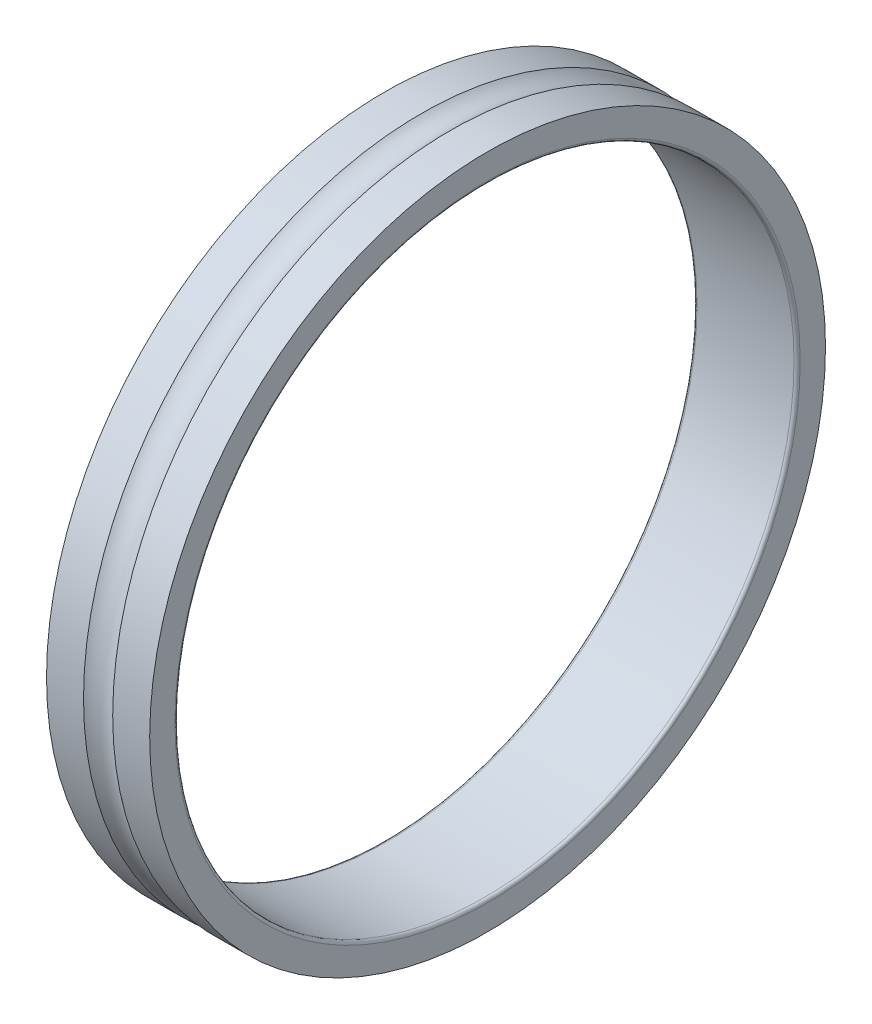
ISO-10303-21;
HEADER;
FILE_DESCRIPTION(('STEP AP214'),'2;1');
FILE_NAME('part.step','',(''),(''),'','','');
FILE_SCHEMA(('AUTOMOTIVE_DESIGN { 1 0 10303 214 1 1 1 1 }'));
ENDSEC;
DATA;
#1=APPLICATION_CONTEXT('core data for automotive mechanical design processes');
#2=APPLICATION_PROTOCOL_DEFINITION('international standard','automotive_design',2000,#1);
#3=PRODUCT_CONTEXT('',#1,'mechanical');
#4=PRODUCT('Part','Part','',(#3));
#5=PRODUCT_RELATED_PRODUCT_CATEGORY('part','',(#4));
#6=PRODUCT_DEFINITION_FORMATION('','',#4);
#7=PRODUCT_DEFINITION_CONTEXT('part definition',#1,'design');
#8=PRODUCT_DEFINITION('design','',#6,#7);
#9=PRODUCT_DEFINITION_SHAPE('','',#8);
#10=(LENGTH_UNIT() NAMED_UNIT(*) SI_UNIT(.MILLI.,.METRE.));
#11=(NAMED_UNIT(*) PLANE_ANGLE_UNIT() SI_UNIT($,.RADIAN.));
#12=(NAMED_UNIT(*) SI_UNIT($,.STERADIAN.) SOLID_ANGLE_UNIT());
#13=UNCERTAINTY_MEASURE_WITH_UNIT(LENGTH_MEASURE(1.E-05),#10,'distance_accuracy_value','');
#14=(GEOMETRIC_REPRESENTATION_CONTEXT(3) GLOBAL_UNCERTAINTY_ASSIGNED_CONTEXT((#13)) GLOBAL_UNIT_ASSIGNED_CONTEXT((#10,
#11,#12)) REPRESENTATION_CONTEXT('',''));
#15=CARTESIAN_POINT('',(0.,0.,0.));
#16=DIRECTION('',(0.,0.,1.));
#17=DIRECTION('',(1.,0.,0.));
#18=AXIS2_PLACEMENT_3D('',#15,#16,#17);
#19=CARTESIAN_POINT('',(0.,32.75,0.));
#20=DIRECTION('',(-1.,0.,0.));
#21=DIRECTION('',(0.,0.,1.));
#22=AXIS2_PLACEMENT_3D('',#19,#20,#21);
#23=PLANE('',#22);
#24=CARTESIAN_POINT('',(0.,0.,0.));
#25=DIRECTION('',(1.,0.,0.));
#26=DIRECTION('',(0.,0.,-1.));
#27=AXIS2_PLACEMENT_3D('',#24,#25,#26);
#28=CIRCLE('',#27,30.3);
#29=CARTESIAN_POINT('',(0.,0.,-30.3));
#30=VERTEX_POINT('',#29);
#31=EDGE_CURVE('E42',#30,#30,#28,.T.);
#32=ORIENTED_EDGE('',*,*,#31,.T.);
#33=EDGE_LOOP('',(#32));
#34=FACE_BOUND('',#33,.T.);
#35=CARTESIAN_POINT('',(0.,0.,0.));
#36=DIRECTION('',(1.,0.,0.));
#37=DIRECTION('',(0.,0.,-1.));
#38=AXIS2_PLACEMENT_3D('',#35,#36,#37);
#39=CIRCLE('',#38,32.75);
#40=CARTESIAN_POINT('',(0.,0.,-32.75));
#41=VERTEX_POINT('',#40);
#42=EDGE_CURVE('E41',#41,#41,#39,.T.);
#43=ORIENTED_EDGE('',*,*,#42,.F.);
#44=EDGE_LOOP('',(#43));
#45=FACE_BOUND('',#44,.T.);
#46=ADVANCED_FACE('F15',(#34,#45),#23,.T.);
#47=CARTESIAN_POINT('',(0.299999999999948,0.,0.));
#48=DIRECTION('',(1.,0.,0.));
#49=DIRECTION('',(0.,0.,-1.));
#50=AXIS2_PLACEMENT_3D('',#47,#48,#49);
#51=TOROIDAL_SURFACE('',#50,30.3,0.299999999999948);
#52=CARTESIAN_POINT('',(0.3,0.,0.));
#53=DIRECTION('',(1.,0.,0.));
#54=DIRECTION('',(0.,0.,-1.));
#55=AXIS2_PLACEMENT_3D('',#52,#53,#54);
#56=CIRCLE('',#55,30.);
#57=CARTESIAN_POINT('',(0.3,0.,-30.));
#58=VERTEX_POINT('',#57);
#59=EDGE_CURVE('E36',#58,#58,#56,.T.);
#60=ORIENTED_EDGE('',*,*,#59,.T.);
#61=EDGE_LOOP('',(#60));
#62=FACE_BOUND('',#61,.T.);
#63=ORIENTED_EDGE('',*,*,#31,.F.);
#64=EDGE_LOOP('',(#63));
#65=FACE_BOUND('',#64,.T.);
#66=ADVANCED_FACE('F49',(#62,#65),#51,.T.);
#67=CARTESIAN_POINT('',(10.,0.,0.));
#68=DIRECTION('',(1.,0.,0.));
#69=DIRECTION('',(0.,0.,-1.));
#70=AXIS2_PLACEMENT_3D('',#67,#68,#69);
#71=CYLINDRICAL_SURFACE('',#70,30.);
#72=CARTESIAN_POINT('',(9.7,0.,0.));
#73=DIRECTION('',(1.,0.,0.));
#74=DIRECTION('',(0.,0.,-1.));
#75=AXIS2_PLACEMENT_3D('',#72,#73,#74);
#76=CIRCLE('',#75,30.);
#77=CARTESIAN_POINT('',(9.7,0.,-30.));
#78=VERTEX_POINT('',#77);
#79=EDGE_CURVE('E34',#78,#78,#76,.T.);
#80=ORIENTED_EDGE('',*,*,#79,.T.);
#81=EDGE_LOOP('',(#80));
#82=FACE_BOUND('',#81,.T.);
#83=ORIENTED_EDGE('',*,*,#59,.F.);
#84=EDGE_LOOP('',(#83));
#85=FACE_BOUND('',#84,.T.);
#86=ADVANCED_FACE('F55',(#82,#85),#71,.F.);
#87=CARTESIAN_POINT('',(9.70000000000011,0.,0.));
#88=DIRECTION('',(1.,0.,0.));
#89=DIRECTION('',(0.,0.,-1.));
#90=AXIS2_PLACEMENT_3D('',#87,#88,#89);
#91=TOROIDAL_SURFACE('',#90,30.3,0.299999999999887);
#92=CARTESIAN_POINT('',(10.,0.,0.));
#93=DIRECTION('',(1.,0.,0.));
#94=DIRECTION('',(0.,0.,-1.));
#95=AXIS2_PLACEMENT_3D('',#92,#93,#94);
#96=CIRCLE('',#95,30.3);
#97=CARTESIAN_POINT('',(10.,0.,-30.3));
#98=VERTEX_POINT('',#97);
#99=EDGE_CURVE('E28',#98,#98,#96,.T.);
#100=ORIENTED_EDGE('',*,*,#99,.T.);
#101=EDGE_LOOP('',(#100));
#102=FACE_BOUND('',#101,.T.);
#103=ORIENTED_EDGE('',*,*,#79,.F.);
#104=EDGE_LOOP('',(#103));
#105=FACE_BOUND('',#104,.T.);
#106=ADVANCED_FACE('F58',(#102,#105),#91,.T.);
#107=CARTESIAN_POINT('',(10.,30.3,0.));
#108=DIRECTION('',(1.,0.,0.));
#109=DIRECTION('',(0.,0.,-1.));
#110=AXIS2_PLACEMENT_3D('',#107,#108,#109);
#111=PLANE('',#110);
#112=CARTESIAN_POINT('',(10.,0.,0.));
#113=DIRECTION('',(1.,0.,0.));
#114=DIRECTION('',(0.,0.,-1.));
#115=AXIS2_PLACEMENT_3D('',#112,#113,#114);
#116=CIRCLE('',#115,32.75);
#117=CARTESIAN_POINT('',(10.,0.,-32.75));
#118=VERTEX_POINT('',#117);
#119=EDGE_CURVE('E27',#118,#118,#116,.T.);
#120=ORIENTED_EDGE('',*,*,#119,.T.);
#121=EDGE_LOOP('',(#120));
#122=FACE_BOUND('',#121,.T.);
#123=ORIENTED_EDGE('',*,*,#99,.F.);
#124=EDGE_LOOP('',(#123));
#125=FACE_BOUND('',#124,.T.);
#126=ADVANCED_FACE('F70',(#122,#125),#111,.T.);
#127=CARTESIAN_POINT('',(10.,0.,0.));
#128=DIRECTION('',(1.,0.,0.));
#129=DIRECTION('',(0.,0.,-1.));
#130=AXIS2_PLACEMENT_3D('',#127,#128,#129);
#131=CYLINDRICAL_SURFACE('',#130,32.75);
#132=CARTESIAN_POINT('',(6.4142135623731,0.,0.));
#133=DIRECTION('',(1.,0.,0.));
#134=DIRECTION('',(0.,0.,-1.));
#135=AXIS2_PLACEMENT_3D('',#132,#133,#134);
#136=CIRCLE('',#135,32.75);
#137=CARTESIAN_POINT('',(6.4142135623731,0.,-32.75));
#138=VERTEX_POINT('',#137);
#139=EDGE_CURVE('E22',#138,#138,#136,.T.);
#140=ORIENTED_EDGE('',*,*,#139,.T.);
#141=EDGE_LOOP('',(#140));
#142=FACE_BOUND('',#141,.T.);
#143=ORIENTED_EDGE('',*,*,#119,.F.);
#144=EDGE_LOOP('',(#143));
#145=FACE_BOUND('',#144,.T.);
#146=ADVANCED_FACE('F75',(#142,#145),#131,.T.);
#147=CARTESIAN_POINT('',(5.,0.,0.));
#148=DIRECTION('',(1.,0.,0.));
#149=DIRECTION('',(0.,0.,-1.));
#150=AXIS2_PLACEMENT_3D('',#147,#148,#149);
#151=TOROIDAL_SURFACE('',#150,34.5,2.25);
#152=ORIENTED_EDGE('',*,*,#139,.F.);
#153=EDGE_LOOP('',(#152));
#154=FACE_BOUND('',#153,.T.);
#155=CARTESIAN_POINT('',(3.5857864376269,0.,0.));
#156=DIRECTION('',(1.,0.,0.));
#157=DIRECTION('',(0.,0.,-1.));
#158=AXIS2_PLACEMENT_3D('',#155,#156,#157);
#159=CIRCLE('',#158,32.75);
#160=CARTESIAN_POINT('',(3.5857864376269,0.,-32.75));
#161=VERTEX_POINT('',#160);
#162=EDGE_CURVE('E10',#161,#161,#159,.T.);
#163=ORIENTED_EDGE('',*,*,#162,.T.);
#164=EDGE_LOOP('',(#163));
#165=FACE_BOUND('',#164,.T.);
#166=ADVANCED_FACE('F72',(#154,#165),#151,.F.);
#167=CARTESIAN_POINT('',(10.,0.,0.));
#168=DIRECTION('',(1.,0.,0.));
#169=DIRECTION('',(0.,0.,-1.));
#170=AXIS2_PLACEMENT_3D('',#167,#168,#169);
#171=CYLINDRICAL_SURFACE('',#170,32.75);
#172=ORIENTED_EDGE('',*,*,#42,.T.);
#173=EDGE_LOOP('',(#172));
#174=FACE_BOUND('',#173,.T.);
#175=ORIENTED_EDGE('',*,*,#162,.F.);
#176=EDGE_LOOP('',(#175));
#177=FACE_BOUND('',#176,.T.);
#178=ADVANCED_FACE('F17',(#174,#177),#171,.T.);
#179=CLOSED_SHELL('',(#46,#66,#86,#106,#126,#146,#166,#178));
#180=MANIFOLD_SOLID_BREP('B1',#179);
#181=ADVANCED_BREP_SHAPE_REPRESENTATION('',(#18,#180),#14);
#182=SHAPE_DEFINITION_REPRESENTATION(#9,#181);
ENDSEC;
END-ISO-10303-21;
